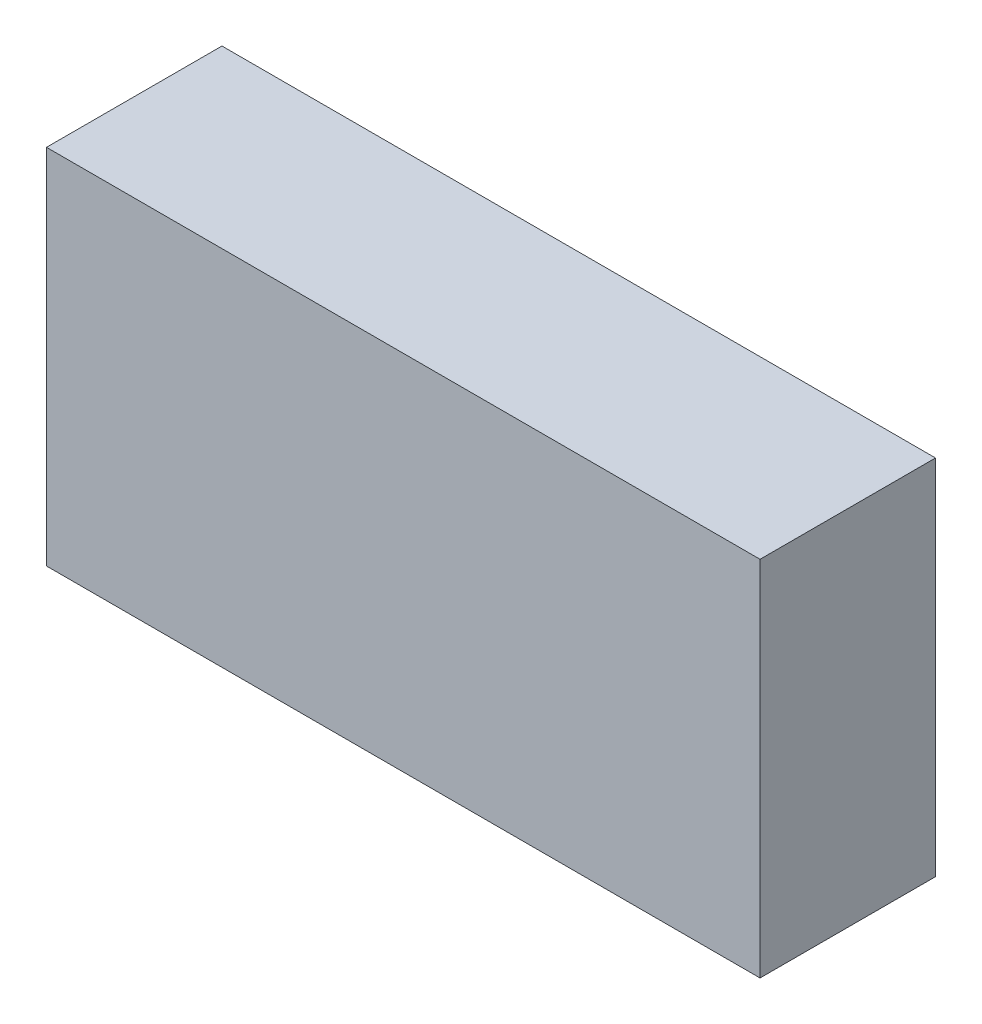
ISO-10303-21;
HEADER;
FILE_DESCRIPTION(('STEP AP214'),'2;1');
FILE_NAME('part.step','',(''),(''),'','','');
FILE_SCHEMA(('AUTOMOTIVE_DESIGN { 1 0 10303 214 1 1 1 1 }'));
ENDSEC;
DATA;
#1=APPLICATION_CONTEXT('core data for automotive mechanical design processes');
#2=APPLICATION_PROTOCOL_DEFINITION('international standard','automotive_design',2000,#1);
#3=PRODUCT_CONTEXT('',#1,'mechanical');
#4=PRODUCT('Part','Part','',(#3));
#5=PRODUCT_RELATED_PRODUCT_CATEGORY('part','',(#4));
#6=PRODUCT_DEFINITION_FORMATION('','',#4);
#7=PRODUCT_DEFINITION_CONTEXT('part definition',#1,'design');
#8=PRODUCT_DEFINITION('design','',#6,#7);
#9=PRODUCT_DEFINITION_SHAPE('','',#8);
#10=(LENGTH_UNIT() NAMED_UNIT(*) SI_UNIT(.MILLI.,.METRE.));
#11=(NAMED_UNIT(*) PLANE_ANGLE_UNIT() SI_UNIT($,.RADIAN.));
#12=(NAMED_UNIT(*) SI_UNIT($,.STERADIAN.) SOLID_ANGLE_UNIT());
#13=UNCERTAINTY_MEASURE_WITH_UNIT(LENGTH_MEASURE(1.E-05),#10,'distance_accuracy_value','');
#14=(GEOMETRIC_REPRESENTATION_CONTEXT(3) GLOBAL_UNCERTAINTY_ASSIGNED_CONTEXT((#13)) GLOBAL_UNIT_ASSIGNED_CONTEXT((#10,
#11,#12)) REPRESENTATION_CONTEXT('',''));
#15=CARTESIAN_POINT('',(0.,0.,0.));
#16=DIRECTION('',(0.,0.,1.));
#17=DIRECTION('',(1.,0.,0.));
#18=AXIS2_PLACEMENT_3D('',#15,#16,#17);
#19=CARTESIAN_POINT('',(-30.5,15.5,15.));
#20=DIRECTION('',(1.,0.,0.));
#21=DIRECTION('',(0.,0.,-1.));
#22=AXIS2_PLACEMENT_3D('',#19,#20,#21);
#23=PLANE('',#22);
#24=DIRECTION('',(0.,-1.,0.));
#25=VECTOR('',#24,1.);
#26=CARTESIAN_POINT('',(-30.5,15.5,0.));
#27=LINE('',#26,#25);
#28=CARTESIAN_POINT('',(-30.5,15.5,0.));
#29=VERTEX_POINT('',#28);
#30=CARTESIAN_POINT('',(-30.5,-15.5,0.));
#31=VERTEX_POINT('',#30);
#32=EDGE_CURVE('E97',#29,#31,#27,.T.);
#33=ORIENTED_EDGE('',*,*,#32,.T.);
#34=DIRECTION('',(0.,0.,-1.));
#35=VECTOR('',#34,1.);
#36=CARTESIAN_POINT('',(-30.5,-15.5,15.));
#37=LINE('',#36,#35);
#38=CARTESIAN_POINT('',(-30.5,-15.5,15.));
#39=VERTEX_POINT('',#38);
#40=EDGE_CURVE('E11',#39,#31,#37,.T.);
#41=ORIENTED_EDGE('',*,*,#40,.F.);
#42=DIRECTION('',(0.,-1.,0.));
#43=VECTOR('',#42,1.);
#44=CARTESIAN_POINT('',(-30.5,15.5,15.));
#45=LINE('',#44,#43);
#46=CARTESIAN_POINT('',(-30.5,15.5,15.));
#47=VERTEX_POINT('',#46);
#48=EDGE_CURVE('E85',#47,#39,#45,.T.);
#49=ORIENTED_EDGE('',*,*,#48,.F.);
#50=DIRECTION('',(0.,0.,-1.));
#51=VECTOR('',#50,1.);
#52=CARTESIAN_POINT('',(-30.5,15.5,15.));
#53=LINE('',#52,#51);
#54=EDGE_CURVE('E93',#47,#29,#53,.T.);
#55=ORIENTED_EDGE('',*,*,#54,.T.);
#56=EDGE_LOOP('',(#33,#41,#49,#55));
#57=FACE_BOUND('',#56,.T.);
#58=ADVANCED_FACE('F34',(#57),#23,.F.);
#59=CARTESIAN_POINT('',(30.5,-15.5,15.));
#60=DIRECTION('',(0.,1.,0.));
#61=DIRECTION('',(-1.,0.,0.));
#62=AXIS2_PLACEMENT_3D('',#59,#60,#61);
#63=PLANE('',#62);
#64=DIRECTION('',(1.,0.,0.));
#65=VECTOR('',#64,1.);
#66=CARTESIAN_POINT('',(30.5,-15.5,0.));
#67=LINE('',#66,#65);
#68=CARTESIAN_POINT('',(30.5,-15.5,0.));
#69=VERTEX_POINT('',#68);
#70=EDGE_CURVE('E89',#31,#69,#67,.T.);
#71=ORIENTED_EDGE('',*,*,#70,.T.);
#72=DIRECTION('',(0.,0.,-1.));
#73=VECTOR('',#72,1.);
#74=CARTESIAN_POINT('',(30.5,-15.5,15.));
#75=LINE('',#74,#73);
#76=CARTESIAN_POINT('',(30.5,-15.5,15.));
#77=VERTEX_POINT('',#76);
#78=EDGE_CURVE('E42',#77,#69,#75,.T.);
#79=ORIENTED_EDGE('',*,*,#78,.F.);
#80=DIRECTION('',(1.,0.,0.));
#81=VECTOR('',#80,1.);
#82=CARTESIAN_POINT('',(30.5,-15.5,15.));
#83=LINE('',#82,#81);
#84=EDGE_CURVE('E80',#39,#77,#83,.T.);
#85=ORIENTED_EDGE('',*,*,#84,.F.);
#86=ORIENTED_EDGE('',*,*,#40,.T.);
#87=EDGE_LOOP('',(#71,#79,#85,#86));
#88=FACE_BOUND('',#87,.T.);
#89=ADVANCED_FACE('F88',(#88),#63,.F.);
#90=CARTESIAN_POINT('',(30.5,15.5,15.));
#91=DIRECTION('',(-1.,0.,0.));
#92=DIRECTION('',(0.,0.,1.));
#93=AXIS2_PLACEMENT_3D('',#90,#91,#92);
#94=PLANE('',#93);
#95=DIRECTION('',(0.,1.,0.));
#96=VECTOR('',#95,1.);
#97=CARTESIAN_POINT('',(30.5,15.5,0.));
#98=LINE('',#97,#96);
#99=CARTESIAN_POINT('',(30.5,15.5,0.));
#100=VERTEX_POINT('',#99);
#101=EDGE_CURVE('E67',#69,#100,#98,.T.);
#102=ORIENTED_EDGE('',*,*,#101,.T.);
#103=DIRECTION('',(0.,0.,-1.));
#104=VECTOR('',#103,1.);
#105=CARTESIAN_POINT('',(30.5,15.5,15.));
#106=LINE('',#105,#104);
#107=CARTESIAN_POINT('',(30.5,15.5,15.));
#108=VERTEX_POINT('',#107);
#109=EDGE_CURVE('E90',#108,#100,#106,.T.);
#110=ORIENTED_EDGE('',*,*,#109,.F.);
#111=DIRECTION('',(0.,1.,0.));
#112=VECTOR('',#111,1.);
#113=CARTESIAN_POINT('',(30.5,15.5,15.));
#114=LINE('',#113,#112);
#115=EDGE_CURVE('E83',#77,#108,#114,.T.);
#116=ORIENTED_EDGE('',*,*,#115,.F.);
#117=ORIENTED_EDGE('',*,*,#78,.T.);
#118=EDGE_LOOP('',(#102,#110,#116,#117));
#119=FACE_BOUND('',#118,.T.);
#120=ADVANCED_FACE('F91',(#119),#94,.F.);
#121=CARTESIAN_POINT('',(30.5,15.5,15.));
#122=DIRECTION('',(0.,-1.,0.));
#123=DIRECTION('',(1.,0.,0.));
#124=AXIS2_PLACEMENT_3D('',#121,#122,#123);
#125=PLANE('',#124);
#126=DIRECTION('',(-1.,0.,0.));
#127=VECTOR('',#126,1.);
#128=CARTESIAN_POINT('',(30.5,15.5,0.));
#129=LINE('',#128,#127);
#130=EDGE_CURVE('E73',#100,#29,#129,.T.);
#131=ORIENTED_EDGE('',*,*,#130,.T.);
#132=ORIENTED_EDGE('',*,*,#54,.F.);
#133=DIRECTION('',(-1.,0.,0.));
#134=VECTOR('',#133,1.);
#135=CARTESIAN_POINT('',(30.5,15.5,15.));
#136=LINE('',#135,#134);
#137=EDGE_CURVE('E50',#108,#47,#136,.T.);
#138=ORIENTED_EDGE('',*,*,#137,.F.);
#139=ORIENTED_EDGE('',*,*,#109,.T.);
#140=EDGE_LOOP('',(#131,#132,#138,#139));
#141=FACE_BOUND('',#140,.T.);
#142=ADVANCED_FACE('F104',(#141),#125,.F.);
#143=CARTESIAN_POINT('',(0.,0.,15.));
#144=DIRECTION('',(0.,0.,-1.));
#145=DIRECTION('',(-1.,0.,0.));
#146=AXIS2_PLACEMENT_3D('',#143,#144,#145);
#147=PLANE('',#146);
#148=ORIENTED_EDGE('',*,*,#48,.T.);
#149=ORIENTED_EDGE('',*,*,#84,.T.);
#150=ORIENTED_EDGE('',*,*,#115,.T.);
#151=ORIENTED_EDGE('',*,*,#137,.T.);
#152=EDGE_LOOP('',(#148,#149,#150,#151));
#153=FACE_BOUND('',#152,.T.);
#154=ADVANCED_FACE('F81',(#153),#147,.F.);
#155=CARTESIAN_POINT('',(0.,0.,0.));
#156=DIRECTION('',(0.,0.,-1.));
#157=DIRECTION('',(-1.,0.,0.));
#158=AXIS2_PLACEMENT_3D('',#155,#156,#157);
#159=PLANE('',#158);
#160=ORIENTED_EDGE('',*,*,#32,.F.);
#161=ORIENTED_EDGE('',*,*,#130,.F.);
#162=ORIENTED_EDGE('',*,*,#101,.F.);
#163=ORIENTED_EDGE('',*,*,#70,.F.);
#164=EDGE_LOOP('',(#160,#161,#162,#163));
#165=FACE_BOUND('',#164,.T.);
#166=ADVANCED_FACE('F107',(#165),#159,.T.);
#167=CLOSED_SHELL('',(#58,#89,#120,#142,#154,#166));
#168=MANIFOLD_SOLID_BREP('B2',#167);
#169=ADVANCED_BREP_SHAPE_REPRESENTATION('',(#18,#168),#14);
#170=SHAPE_DEFINITION_REPRESENTATION(#9,#169);
ENDSEC;
END-ISO-10303-21;
